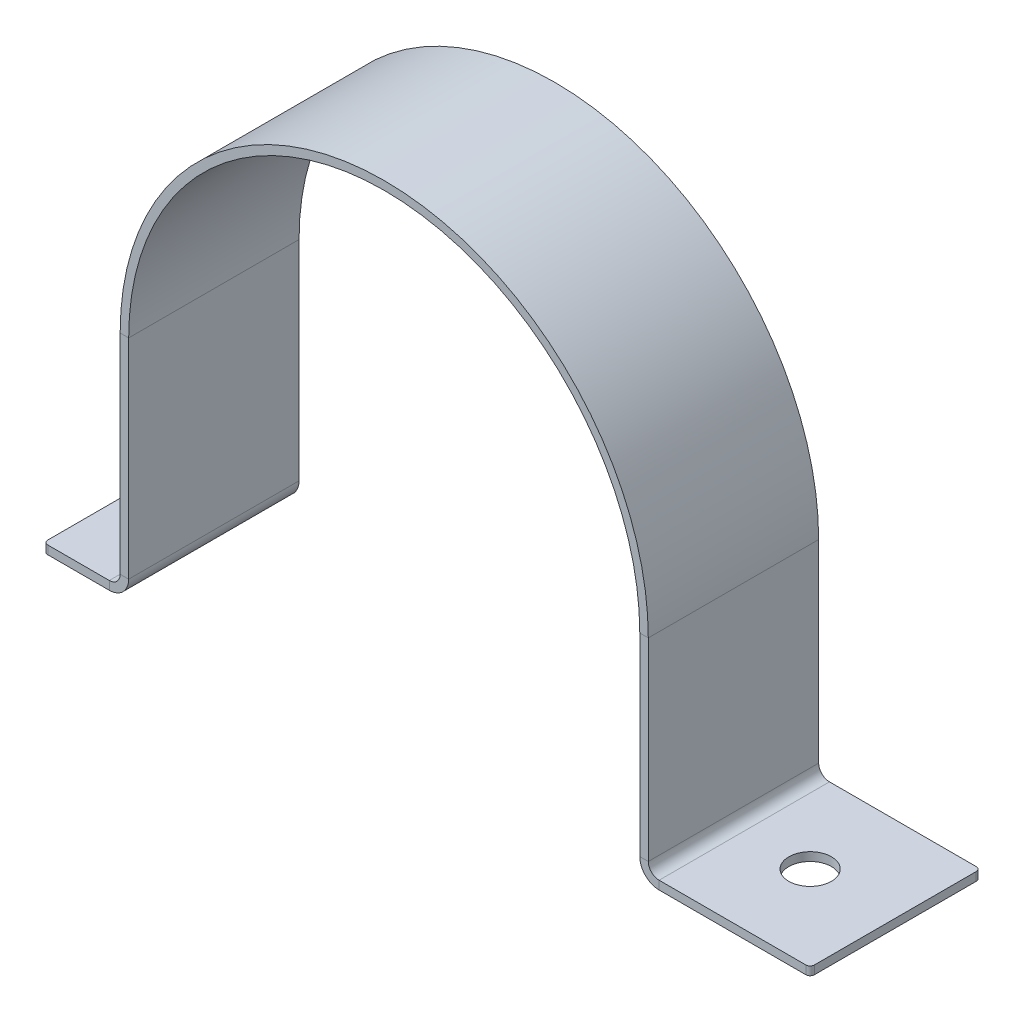
ISO-10303-21;
HEADER;
FILE_DESCRIPTION(('STEP AP214'),'2;1');
FILE_NAME('part.step','',(''),(''),'','','');
FILE_SCHEMA(('AUTOMOTIVE_DESIGN { 1 0 10303 214 1 1 1 1 }'));
ENDSEC;
DATA;
#1=APPLICATION_CONTEXT('core data for automotive mechanical design processes');
#2=APPLICATION_PROTOCOL_DEFINITION('international standard','automotive_design',2000,#1);
#3=PRODUCT_CONTEXT('',#1,'mechanical');
#4=PRODUCT('Part','Part','',(#3));
#5=PRODUCT_RELATED_PRODUCT_CATEGORY('part','',(#4));
#6=PRODUCT_DEFINITION_FORMATION('','',#4);
#7=PRODUCT_DEFINITION_CONTEXT('part definition',#1,'design');
#8=PRODUCT_DEFINITION('design','',#6,#7);
#9=PRODUCT_DEFINITION_SHAPE('','',#8);
#10=(LENGTH_UNIT() NAMED_UNIT(*) SI_UNIT(.MILLI.,.METRE.));
#11=(NAMED_UNIT(*) PLANE_ANGLE_UNIT() SI_UNIT($,.RADIAN.));
#12=(NAMED_UNIT(*) SI_UNIT($,.STERADIAN.) SOLID_ANGLE_UNIT());
#13=UNCERTAINTY_MEASURE_WITH_UNIT(LENGTH_MEASURE(1.E-05),#10,'distance_accuracy_value','');
#14=(GEOMETRIC_REPRESENTATION_CONTEXT(3) GLOBAL_UNCERTAINTY_ASSIGNED_CONTEXT((#13)) GLOBAL_UNIT_ASSIGNED_CONTEXT((#10,
#11,#12)) REPRESENTATION_CONTEXT('',''));
#15=CARTESIAN_POINT('',(0.,0.,0.));
#16=DIRECTION('',(0.,0.,1.));
#17=DIRECTION('',(1.,0.,0.));
#18=AXIS2_PLACEMENT_3D('',#15,#16,#17);
#19=CARTESIAN_POINT('',(-30.,0.,20.));
#20=DIRECTION('',(0.,0.,1.));
#21=DIRECTION('',(1.,0.,0.));
#22=AXIS2_PLACEMENT_3D('',#19,#20,#21);
#23=PLANE('',#22);
#24=DIRECTION('',(-1.,0.,0.));
#25=VECTOR('',#24,1.);
#26=CARTESIAN_POINT('',(-30.,0.,20.));
#27=LINE('',#26,#25);
#28=CARTESIAN_POINT('',(-30.,0.,20.));
#29=VERTEX_POINT('',#28);
#30=CARTESIAN_POINT('',(-31.,0.,20.));
#31=VERTEX_POINT('',#30);
#32=EDGE_CURVE('E343',#29,#31,#27,.T.);
#33=ORIENTED_EDGE('',*,*,#32,.F.);
#34=CARTESIAN_POINT('',(0.,0.,20.));
#35=DIRECTION('',(0.,0.,1.));
#36=DIRECTION('',(1.,0.,0.));
#37=AXIS2_PLACEMENT_3D('',#34,#35,#36);
#38=CIRCLE('',#37,30.);
#39=CARTESIAN_POINT('',(30.,0.,20.));
#40=VERTEX_POINT('',#39);
#41=EDGE_CURVE('E216',#40,#29,#38,.T.);
#42=ORIENTED_EDGE('',*,*,#41,.F.);
#43=DIRECTION('',(-1.,0.,0.));
#44=VECTOR('',#43,1.);
#45=CARTESIAN_POINT('',(31.,0.,20.));
#46=LINE('',#45,#44);
#47=CARTESIAN_POINT('',(31.,0.,20.));
#48=VERTEX_POINT('',#47);
#49=EDGE_CURVE('E341',#48,#40,#46,.T.);
#50=ORIENTED_EDGE('',*,*,#49,.F.);
#51=CARTESIAN_POINT('',(0.,0.,20.));
#52=DIRECTION('',(0.,0.,1.));
#53=DIRECTION('',(1.,0.,0.));
#54=AXIS2_PLACEMENT_3D('',#51,#52,#53);
#55=CIRCLE('',#54,31.);
#56=EDGE_CURVE('E238',#48,#31,#55,.T.);
#57=ORIENTED_EDGE('',*,*,#56,.T.);
#58=EDGE_LOOP('',(#33,#42,#50,#57));
#59=FACE_BOUND('',#58,.T.);
#60=ADVANCED_FACE('F37',(#59),#23,.T.);
#61=CARTESIAN_POINT('',(31.,0.,20.));
#62=DIRECTION('',(0.,0.,1.));
#63=DIRECTION('',(1.,0.,0.));
#64=AXIS2_PLACEMENT_3D('',#61,#62,#63);
#65=PLANE('',#64);
#66=DIRECTION('',(0.,-1.,0.));
#67=VECTOR('',#66,1.);
#68=CARTESIAN_POINT('',(-30.,0.,20.));
#69=LINE('',#68,#67);
#70=CARTESIAN_POINT('',(-30.,-24.53,20.));
#71=VERTEX_POINT('',#70);
#72=EDGE_CURVE('E214',#29,#71,#69,.T.);
#73=ORIENTED_EDGE('',*,*,#72,.F.);
#74=ORIENTED_EDGE('',*,*,#32,.T.);
#75=DIRECTION('',(0.,1.,0.));
#76=VECTOR('',#75,1.);
#77=CARTESIAN_POINT('',(-31.,0.,20.));
#78=LINE('',#77,#76);
#79=CARTESIAN_POINT('',(-31.,-24.53,20.));
#80=VERTEX_POINT('',#79);
#81=EDGE_CURVE('E241',#31,#80,#78,.F.);
#82=ORIENTED_EDGE('',*,*,#81,.T.);
#83=DIRECTION('',(1.,0.,0.));
#84=VECTOR('',#83,1.);
#85=CARTESIAN_POINT('',(-31.,-24.53,20.));
#86=LINE('',#85,#84);
#87=EDGE_CURVE('E188',#80,#71,#86,.T.);
#88=ORIENTED_EDGE('',*,*,#87,.T.);
#89=EDGE_LOOP('',(#73,#74,#82,#88));
#90=FACE_BOUND('',#89,.T.);
#91=ADVANCED_FACE('F427',(#90),#65,.T.);
#92=CARTESIAN_POINT('',(30.,0.,0.));
#93=DIRECTION('',(0.,0.,-1.));
#94=DIRECTION('',(-1.,0.,0.));
#95=AXIS2_PLACEMENT_3D('',#92,#93,#94);
#96=PLANE('',#95);
#97=DIRECTION('',(1.,0.,0.));
#98=VECTOR('',#97,1.);
#99=CARTESIAN_POINT('',(30.,0.,0.));
#100=LINE('',#99,#98);
#101=CARTESIAN_POINT('',(30.,0.,0.));
#102=VERTEX_POINT('',#101);
#103=CARTESIAN_POINT('',(31.,0.,0.));
#104=VERTEX_POINT('',#103);
#105=EDGE_CURVE('E339',#102,#104,#100,.T.);
#106=ORIENTED_EDGE('',*,*,#105,.F.);
#107=CARTESIAN_POINT('',(0.,0.,0.));
#108=DIRECTION('',(0.,0.,1.));
#109=DIRECTION('',(1.,0.,0.));
#110=AXIS2_PLACEMENT_3D('',#107,#108,#109);
#111=CIRCLE('',#110,30.);
#112=CARTESIAN_POINT('',(-30.,0.,0.));
#113=VERTEX_POINT('',#112);
#114=EDGE_CURVE('E256',#102,#113,#111,.T.);
#115=ORIENTED_EDGE('',*,*,#114,.T.);
#116=DIRECTION('',(1.,0.,0.));
#117=VECTOR('',#116,1.);
#118=CARTESIAN_POINT('',(-31.,0.,0.));
#119=LINE('',#118,#117);
#120=CARTESIAN_POINT('',(-31.,0.,0.));
#121=VERTEX_POINT('',#120);
#122=EDGE_CURVE('E337',#121,#113,#119,.T.);
#123=ORIENTED_EDGE('',*,*,#122,.F.);
#124=CARTESIAN_POINT('',(0.,0.,0.));
#125=DIRECTION('',(0.,0.,1.));
#126=DIRECTION('',(1.,0.,0.));
#127=AXIS2_PLACEMENT_3D('',#124,#125,#126);
#128=CIRCLE('',#127,31.);
#129=EDGE_CURVE('E275',#104,#121,#128,.T.);
#130=ORIENTED_EDGE('',*,*,#129,.F.);
#131=EDGE_LOOP('',(#106,#115,#123,#130));
#132=FACE_BOUND('',#131,.T.);
#133=ADVANCED_FACE('F466',(#132),#96,.T.);
#134=CARTESIAN_POINT('',(-31.,0.,0.));
#135=DIRECTION('',(0.,0.,-1.));
#136=DIRECTION('',(-1.,0.,0.));
#137=AXIS2_PLACEMENT_3D('',#134,#135,#136);
#138=PLANE('',#137);
#139=DIRECTION('',(0.,1.,0.));
#140=VECTOR('',#139,1.);
#141=CARTESIAN_POINT('',(30.,0.,0.));
#142=LINE('',#141,#140);
#143=CARTESIAN_POINT('',(30.,-22.73,0.));
#144=VERTEX_POINT('',#143);
#145=EDGE_CURVE('E259',#144,#102,#142,.T.);
#146=ORIENTED_EDGE('',*,*,#145,.T.);
#147=ORIENTED_EDGE('',*,*,#105,.T.);
#148=DIRECTION('',(0.,1.,0.));
#149=VECTOR('',#148,1.);
#150=CARTESIAN_POINT('',(31.,0.,0.));
#151=LINE('',#150,#149);
#152=CARTESIAN_POINT('',(31.,-22.73,0.));
#153=VERTEX_POINT('',#152);
#154=EDGE_CURVE('E272',#153,#104,#151,.T.);
#155=ORIENTED_EDGE('',*,*,#154,.F.);
#156=DIRECTION('',(-1.,0.,0.));
#157=VECTOR('',#156,1.);
#158=CARTESIAN_POINT('',(31.,-22.73,0.));
#159=LINE('',#158,#157);
#160=EDGE_CURVE('E187',#153,#144,#159,.T.);
#161=ORIENTED_EDGE('',*,*,#160,.T.);
#162=EDGE_LOOP('',(#146,#147,#155,#161));
#163=FACE_BOUND('',#162,.T.);
#164=ADVANCED_FACE('F749',(#163),#138,.T.);
#165=CARTESIAN_POINT('',(30.,-22.73,20.));
#166=DIRECTION('',(0.,0.,1.));
#167=DIRECTION('',(1.,0.,0.));
#168=AXIS2_PLACEMENT_3D('',#165,#166,#167);
#169=PLANE('',#168);
#170=DIRECTION('',(1.,0.,0.));
#171=VECTOR('',#170,1.);
#172=CARTESIAN_POINT('',(30.,-22.73,20.));
#173=LINE('',#172,#171);
#174=CARTESIAN_POINT('',(30.,-22.73,20.));
#175=VERTEX_POINT('',#174);
#176=CARTESIAN_POINT('',(31.,-22.73,20.));
#177=VERTEX_POINT('',#176);
#178=EDGE_CURVE('E335',#175,#177,#173,.T.);
#179=ORIENTED_EDGE('',*,*,#178,.F.);
#180=CARTESIAN_POINT('',(32.27,-22.73,20.));
#181=DIRECTION('',(0.,0.,1.));
#182=DIRECTION('',(1.,0.,0.));
#183=AXIS2_PLACEMENT_3D('',#180,#181,#182);
#184=CIRCLE('',#183,2.27);
#185=CARTESIAN_POINT('',(32.27,-25.,20.));
#186=VERTEX_POINT('',#185);
#187=EDGE_CURVE('E225',#186,#175,#184,.F.);
#188=ORIENTED_EDGE('',*,*,#187,.F.);
#189=DIRECTION('',(0.,-1.,0.));
#190=VECTOR('',#189,1.);
#191=CARTESIAN_POINT('',(32.27,-24.,20.));
#192=LINE('',#191,#190);
#193=CARTESIAN_POINT('',(32.27,-24.,20.));
#194=VERTEX_POINT('',#193);
#195=EDGE_CURVE('E332',#194,#186,#192,.T.);
#196=ORIENTED_EDGE('',*,*,#195,.F.);
#197=CARTESIAN_POINT('',(32.27,-22.73,20.));
#198=DIRECTION('',(0.,0.,1.));
#199=DIRECTION('',(1.,0.,0.));
#200=AXIS2_PLACEMENT_3D('',#197,#198,#199);
#201=CIRCLE('',#200,1.27);
#202=EDGE_CURVE('E232',#194,#177,#201,.F.);
#203=ORIENTED_EDGE('',*,*,#202,.T.);
#204=EDGE_LOOP('',(#179,#188,#196,#203));
#205=FACE_BOUND('',#204,.T.);
#206=ADVANCED_FACE('F401',(#205),#169,.T.);
#207=CARTESIAN_POINT('',(32.27,-24.,20.));
#208=DIRECTION('',(0.,0.,1.));
#209=DIRECTION('',(1.,0.,0.));
#210=AXIS2_PLACEMENT_3D('',#207,#208,#209);
#211=PLANE('',#210);
#212=DIRECTION('',(0.,1.,0.));
#213=VECTOR('',#212,1.);
#214=CARTESIAN_POINT('',(30.,0.,20.));
#215=LINE('',#214,#213);
#216=EDGE_CURVE('E222',#175,#40,#215,.T.);
#217=ORIENTED_EDGE('',*,*,#216,.F.);
#218=ORIENTED_EDGE('',*,*,#178,.T.);
#219=DIRECTION('',(0.,1.,0.));
#220=VECTOR('',#219,1.);
#221=CARTESIAN_POINT('',(31.,0.,20.));
#222=LINE('',#221,#220);
#223=EDGE_CURVE('E235',#177,#48,#222,.T.);
#224=ORIENTED_EDGE('',*,*,#223,.T.);
#225=ORIENTED_EDGE('',*,*,#49,.T.);
#226=EDGE_LOOP('',(#217,#218,#224,#225));
#227=FACE_BOUND('',#226,.T.);
#228=ADVANCED_FACE('F410',(#227),#211,.T.);
#229=CARTESIAN_POINT('',(32.27,-25.,0.));
#230=DIRECTION('',(0.,0.,-1.));
#231=DIRECTION('',(-1.,0.,0.));
#232=AXIS2_PLACEMENT_3D('',#229,#230,#231);
#233=PLANE('',#232);
#234=DIRECTION('',(0.,1.,0.));
#235=VECTOR('',#234,1.);
#236=CARTESIAN_POINT('',(32.27,-25.,0.));
#237=LINE('',#236,#235);
#238=CARTESIAN_POINT('',(32.27,-25.,0.));
#239=VERTEX_POINT('',#238);
#240=CARTESIAN_POINT('',(32.27,-24.,0.));
#241=VERTEX_POINT('',#240);
#242=EDGE_CURVE('E329',#239,#241,#237,.T.);
#243=ORIENTED_EDGE('',*,*,#242,.F.);
#244=CARTESIAN_POINT('',(32.27,-22.73,0.));
#245=DIRECTION('',(0.,0.,1.));
#246=DIRECTION('',(1.,0.,0.));
#247=AXIS2_PLACEMENT_3D('',#244,#245,#246);
#248=CIRCLE('',#247,2.27);
#249=EDGE_CURVE('E262',#239,#144,#248,.F.);
#250=ORIENTED_EDGE('',*,*,#249,.T.);
#251=ORIENTED_EDGE('',*,*,#160,.F.);
#252=CARTESIAN_POINT('',(32.27,-22.73,0.));
#253=DIRECTION('',(0.,0.,1.));
#254=DIRECTION('',(1.,0.,0.));
#255=AXIS2_PLACEMENT_3D('',#252,#253,#254);
#256=CIRCLE('',#255,1.27);
#257=EDGE_CURVE('E269',#241,#153,#256,.F.);
#258=ORIENTED_EDGE('',*,*,#257,.F.);
#259=EDGE_LOOP('',(#243,#250,#251,#258));
#260=FACE_BOUND('',#259,.T.);
#261=ADVANCED_FACE('F605',(#260),#233,.T.);
#262=CARTESIAN_POINT('',(31.,-22.73,0.));
#263=DIRECTION('',(0.,0.,-1.));
#264=DIRECTION('',(-1.,0.,0.));
#265=AXIS2_PLACEMENT_3D('',#262,#263,#264);
#266=PLANE('',#265);
#267=DIRECTION('',(-1.,0.,0.));
#268=VECTOR('',#267,1.);
#269=CARTESIAN_POINT('',(30.,-24.,0.));
#270=LINE('',#269,#268);
#271=CARTESIAN_POINT('',(49.5,-24.,0.));
#272=VERTEX_POINT('',#271);
#273=EDGE_CURVE('E267',#272,#241,#270,.T.);
#274=ORIENTED_EDGE('',*,*,#273,.F.);
#275=DIRECTION('',(0.,-1.,0.));
#276=VECTOR('',#275,1.);
#277=CARTESIAN_POINT('',(49.5,-22.73,0.));
#278=LINE('',#277,#276);
#279=CARTESIAN_POINT('',(49.5,-25.,0.));
#280=VERTEX_POINT('',#279);
#281=EDGE_CURVE('E362',#272,#280,#278,.T.);
#282=ORIENTED_EDGE('',*,*,#281,.T.);
#283=DIRECTION('',(-1.,0.,0.));
#284=VECTOR('',#283,1.);
#285=CARTESIAN_POINT('',(30.,-25.,0.));
#286=LINE('',#285,#284);
#287=EDGE_CURVE('E265',#280,#239,#286,.T.);
#288=ORIENTED_EDGE('',*,*,#287,.T.);
#289=ORIENTED_EDGE('',*,*,#242,.T.);
#290=EDGE_LOOP('',(#274,#282,#288,#289));
#291=FACE_BOUND('',#290,.T.);
#292=ADVANCED_FACE('F382',(#291),#266,.T.);
#293=CARTESIAN_POINT('',(-32.27,-26.8,20.));
#294=DIRECTION('',(0.,0.,1.));
#295=DIRECTION('',(1.,0.,0.));
#296=AXIS2_PLACEMENT_3D('',#293,#294,#295);
#297=PLANE('',#296);
#298=DIRECTION('',(0.,1.,0.));
#299=VECTOR('',#298,1.);
#300=CARTESIAN_POINT('',(-32.27,-26.8,20.));
#301=LINE('',#300,#299);
#302=CARTESIAN_POINT('',(-32.27,-26.8,20.));
#303=VERTEX_POINT('',#302);
#304=CARTESIAN_POINT('',(-32.27,-25.8,20.));
#305=VERTEX_POINT('',#304);
#306=EDGE_CURVE('E175',#303,#305,#301,.T.);
#307=ORIENTED_EDGE('',*,*,#306,.F.);
#308=CARTESIAN_POINT('',(-32.27,-24.53,20.));
#309=DIRECTION('',(0.,0.,1.));
#310=DIRECTION('',(1.,0.,0.));
#311=AXIS2_PLACEMENT_3D('',#308,#309,#310);
#312=CIRCLE('',#311,2.27);
#313=EDGE_CURVE('E179',#71,#303,#312,.F.);
#314=ORIENTED_EDGE('',*,*,#313,.F.);
#315=ORIENTED_EDGE('',*,*,#87,.F.);
#316=CARTESIAN_POINT('',(-32.27,-24.53,20.));
#317=DIRECTION('',(0.,0.,1.));
#318=DIRECTION('',(1.,0.,0.));
#319=AXIS2_PLACEMENT_3D('',#316,#317,#318);
#320=CIRCLE('',#319,1.27);
#321=EDGE_CURVE('E182',#80,#305,#320,.F.);
#322=ORIENTED_EDGE('',*,*,#321,.T.);
#323=EDGE_LOOP('',(#307,#314,#315,#322));
#324=FACE_BOUND('',#323,.T.);
#325=ADVANCED_FACE('F177',(#324),#297,.T.);
#326=CARTESIAN_POINT('',(-31.,-24.53,20.));
#327=DIRECTION('',(0.,0.,1.));
#328=DIRECTION('',(1.,0.,0.));
#329=AXIS2_PLACEMENT_3D('',#326,#327,#328);
#330=PLANE('',#329);
#331=DIRECTION('',(1.,0.,0.));
#332=VECTOR('',#331,1.);
#333=CARTESIAN_POINT('',(-30.,-25.8,20.));
#334=LINE('',#333,#332);
#335=CARTESIAN_POINT('',(-39.5,-25.8,20.));
#336=VERTEX_POINT('',#335);
#337=EDGE_CURVE('E209',#305,#336,#334,.F.);
#338=ORIENTED_EDGE('',*,*,#337,.T.);
#339=DIRECTION('',(0.,1.,0.));
#340=VECTOR('',#339,1.);
#341=CARTESIAN_POINT('',(-39.5,-24.53,20.));
#342=LINE('',#341,#340);
#343=CARTESIAN_POINT('',(-39.5,-26.8,20.));
#344=VERTEX_POINT('',#343);
#345=EDGE_CURVE('E208',#336,#344,#342,.F.);
#346=ORIENTED_EDGE('',*,*,#345,.T.);
#347=DIRECTION('',(-1.,0.,0.));
#348=VECTOR('',#347,1.);
#349=CARTESIAN_POINT('',(-30.,-26.8,20.));
#350=LINE('',#349,#348);
#351=EDGE_CURVE('E196',#303,#344,#350,.T.);
#352=ORIENTED_EDGE('',*,*,#351,.F.);
#353=ORIENTED_EDGE('',*,*,#306,.T.);
#354=EDGE_LOOP('',(#338,#346,#352,#353));
#355=FACE_BOUND('',#354,.T.);
#356=ADVANCED_FACE('F206',(#355),#330,.T.);
#357=CARTESIAN_POINT('',(-30.,-24.53,0.));
#358=DIRECTION('',(0.,0.,-1.));
#359=DIRECTION('',(-1.,0.,0.));
#360=AXIS2_PLACEMENT_3D('',#357,#358,#359);
#361=PLANE('',#360);
#362=DIRECTION('',(-1.,0.,0.));
#363=VECTOR('',#362,1.);
#364=CARTESIAN_POINT('',(-30.,-24.53,0.));
#365=LINE('',#364,#363);
#366=CARTESIAN_POINT('',(-30.,-24.53,0.));
#367=VERTEX_POINT('',#366);
#368=CARTESIAN_POINT('',(-31.,-24.53,0.));
#369=VERTEX_POINT('',#368);
#370=EDGE_CURVE('E325',#367,#369,#365,.T.);
#371=ORIENTED_EDGE('',*,*,#370,.F.);
#372=CARTESIAN_POINT('',(-32.27,-24.53,0.));
#373=DIRECTION('',(0.,0.,1.));
#374=DIRECTION('',(1.,0.,0.));
#375=AXIS2_PLACEMENT_3D('',#372,#373,#374);
#376=CIRCLE('',#375,2.27);
#377=CARTESIAN_POINT('',(-32.27,-26.8,0.));
#378=VERTEX_POINT('',#377);
#379=EDGE_CURVE('E251',#367,#378,#376,.F.);
#380=ORIENTED_EDGE('',*,*,#379,.T.);
#381=DIRECTION('',(0.,-1.,0.));
#382=VECTOR('',#381,1.);
#383=CARTESIAN_POINT('',(-32.27,-25.8,0.));
#384=LINE('',#383,#382);
#385=CARTESIAN_POINT('',(-32.27,-25.8,0.));
#386=VERTEX_POINT('',#385);
#387=EDGE_CURVE('E323',#386,#378,#384,.T.);
#388=ORIENTED_EDGE('',*,*,#387,.F.);
#389=CARTESIAN_POINT('',(-32.27,-24.53,0.));
#390=DIRECTION('',(0.,0.,1.));
#391=DIRECTION('',(1.,0.,0.));
#392=AXIS2_PLACEMENT_3D('',#389,#390,#391);
#393=CIRCLE('',#392,1.27);
#394=EDGE_CURVE('E281',#369,#386,#393,.F.);
#395=ORIENTED_EDGE('',*,*,#394,.F.);
#396=EDGE_LOOP('',(#371,#380,#388,#395));
#397=FACE_BOUND('',#396,.T.);
#398=ADVANCED_FACE('F591',(#397),#361,.T.);
#399=CARTESIAN_POINT('',(-32.27,-25.8,0.));
#400=DIRECTION('',(0.,0.,-1.));
#401=DIRECTION('',(-1.,0.,0.));
#402=AXIS2_PLACEMENT_3D('',#399,#400,#401);
#403=PLANE('',#402);
#404=DIRECTION('',(0.,-1.,0.));
#405=VECTOR('',#404,1.);
#406=CARTESIAN_POINT('',(-30.,0.,0.));
#407=LINE('',#406,#405);
#408=EDGE_CURVE('E253',#113,#367,#407,.T.);
#409=ORIENTED_EDGE('',*,*,#408,.T.);
#410=ORIENTED_EDGE('',*,*,#370,.T.);
#411=DIRECTION('',(0.,1.,0.));
#412=VECTOR('',#411,1.);
#413=CARTESIAN_POINT('',(-31.,0.,0.));
#414=LINE('',#413,#412);
#415=EDGE_CURVE('E278',#121,#369,#414,.F.);
#416=ORIENTED_EDGE('',*,*,#415,.F.);
#417=ORIENTED_EDGE('',*,*,#122,.T.);
#418=EDGE_LOOP('',(#409,#410,#416,#417));
#419=FACE_BOUND('',#418,.T.);
#420=ADVANCED_FACE('F579',(#419),#403,.T.);
#421=CARTESIAN_POINT('',(-30.,-25.8,20.));
#422=DIRECTION('',(0.,-1.,0.));
#423=DIRECTION('',(0.,0.,-1.));
#424=AXIS2_PLACEMENT_3D('',#421,#422,#423);
#425=PLANE('',#424);
#426=DIRECTION('',(0.,0.,-1.));
#427=VECTOR('',#426,1.);
#428=CARTESIAN_POINT('',(-40.,-25.8,20.));
#429=LINE('',#428,#427);
#430=CARTESIAN_POINT('',(-40.,-25.8,19.5));
#431=VERTEX_POINT('',#430);
#432=CARTESIAN_POINT('',(-40.,-25.8,0.5));
#433=VERTEX_POINT('',#432);
#434=EDGE_CURVE('E320',#431,#433,#429,.T.);
#435=ORIENTED_EDGE('',*,*,#434,.F.);
#436=CARTESIAN_POINT('',(-39.5,-25.8,19.5));
#437=DIRECTION('',(0.,-1.,0.));
#438=DIRECTION('',(0.,0.,-1.));
#439=AXIS2_PLACEMENT_3D('',#436,#437,#438);
#440=CIRCLE('',#439,0.5);
#441=EDGE_CURVE('E352',#431,#336,#440,.F.);
#442=ORIENTED_EDGE('',*,*,#441,.T.);
#443=ORIENTED_EDGE('',*,*,#337,.F.);
#444=DIRECTION('',(0.,0.,-1.));
#445=VECTOR('',#444,1.);
#446=CARTESIAN_POINT('',(-32.27,-25.8,20.));
#447=LINE('',#446,#445);
#448=EDGE_CURVE('E245',#305,#386,#447,.T.);
#449=ORIENTED_EDGE('',*,*,#448,.T.);
#450=DIRECTION('',(1.,0.,0.));
#451=VECTOR('',#450,1.);
#452=CARTESIAN_POINT('',(-30.,-25.8,0.));
#453=LINE('',#452,#451);
#454=CARTESIAN_POINT('',(-39.5,-25.8,0.));
#455=VERTEX_POINT('',#454);
#456=EDGE_CURVE('E246',#386,#455,#453,.F.);
#457=ORIENTED_EDGE('',*,*,#456,.T.);
#458=CARTESIAN_POINT('',(-39.5,-25.8,0.5));
#459=DIRECTION('',(0.,-1.,0.));
#460=DIRECTION('',(0.,0.,-1.));
#461=AXIS2_PLACEMENT_3D('',#458,#459,#460);
#462=CIRCLE('',#461,0.5);
#463=EDGE_CURVE('E350',#455,#433,#462,.F.);
#464=ORIENTED_EDGE('',*,*,#463,.T.);
#465=EDGE_LOOP('',(#435,#442,#443,#449,#457,#464));
#466=FACE_BOUND('',#465,.T.);
#467=ADVANCED_FACE('F440',(#466),#425,.F.);
#468=CARTESIAN_POINT('',(-40.,-26.8,20.));
#469=DIRECTION('',(-1.,0.,0.));
#470=DIRECTION('',(0.,0.,1.));
#471=AXIS2_PLACEMENT_3D('',#468,#469,#470);
#472=PLANE('',#471);
#473=DIRECTION('',(0.,0.,-1.));
#474=VECTOR('',#473,1.);
#475=CARTESIAN_POINT('',(-40.,-26.8,20.));
#476=LINE('',#475,#474);
#477=CARTESIAN_POINT('',(-40.,-26.8,19.5));
#478=VERTEX_POINT('',#477);
#479=CARTESIAN_POINT('',(-40.,-26.8,0.5));
#480=VERTEX_POINT('',#479);
#481=EDGE_CURVE('E203',#478,#480,#476,.T.);
#482=ORIENTED_EDGE('',*,*,#481,.F.);
#483=DIRECTION('',(0.,1.,0.));
#484=VECTOR('',#483,1.);
#485=CARTESIAN_POINT('',(-40.,-26.8,19.5));
#486=LINE('',#485,#484);
#487=EDGE_CURVE('E347',#478,#431,#486,.T.);
#488=ORIENTED_EDGE('',*,*,#487,.T.);
#489=ORIENTED_EDGE('',*,*,#434,.T.);
#490=DIRECTION('',(0.,1.,0.));
#491=VECTOR('',#490,1.);
#492=CARTESIAN_POINT('',(-40.,-26.8,0.5));
#493=LINE('',#492,#491);
#494=EDGE_CURVE('E345',#433,#480,#493,.F.);
#495=ORIENTED_EDGE('',*,*,#494,.T.);
#496=EDGE_LOOP('',(#482,#488,#489,#495));
#497=FACE_BOUND('',#496,.T.);
#498=ADVANCED_FACE('F557',(#497),#472,.T.);
#499=CARTESIAN_POINT('',(-30.,-26.8,20.));
#500=DIRECTION('',(0.,-1.,0.));
#501=DIRECTION('',(0.,0.,-1.));
#502=AXIS2_PLACEMENT_3D('',#499,#500,#501);
#503=PLANE('',#502);
#504=ORIENTED_EDGE('',*,*,#351,.T.);
#505=CARTESIAN_POINT('',(-39.5,-26.8,19.5));
#506=DIRECTION('',(0.,-1.,0.));
#507=DIRECTION('',(0.,0.,-1.));
#508=AXIS2_PLACEMENT_3D('',#505,#506,#507);
#509=CIRCLE('',#508,0.5);
#510=EDGE_CURVE('E357',#344,#478,#509,.T.);
#511=ORIENTED_EDGE('',*,*,#510,.T.);
#512=ORIENTED_EDGE('',*,*,#481,.T.);
#513=CARTESIAN_POINT('',(-39.5,-26.8,0.5));
#514=DIRECTION('',(0.,-1.,0.));
#515=DIRECTION('',(0.,0.,-1.));
#516=AXIS2_PLACEMENT_3D('',#513,#514,#515);
#517=CIRCLE('',#516,0.5);
#518=CARTESIAN_POINT('',(-39.5,-26.8,0.));
#519=VERTEX_POINT('',#518);
#520=EDGE_CURVE('E355',#480,#519,#517,.T.);
#521=ORIENTED_EDGE('',*,*,#520,.T.);
#522=DIRECTION('',(-1.,0.,0.));
#523=VECTOR('',#522,1.);
#524=CARTESIAN_POINT('',(-30.,-26.8,0.));
#525=LINE('',#524,#523);
#526=EDGE_CURVE('E199',#378,#519,#525,.T.);
#527=ORIENTED_EDGE('',*,*,#526,.F.);
#528=DIRECTION('',(0.,0.,-1.));
#529=VECTOR('',#528,1.);
#530=CARTESIAN_POINT('',(-32.27,-26.8,20.));
#531=LINE('',#530,#529);
#532=EDGE_CURVE('E194',#303,#378,#531,.T.);
#533=ORIENTED_EDGE('',*,*,#532,.F.);
#534=EDGE_LOOP('',(#504,#511,#512,#521,#527,#533));
#535=FACE_BOUND('',#534,.T.);
#536=ADVANCED_FACE('F195',(#535),#503,.T.);
#537=CARTESIAN_POINT('',(-32.27,-24.53,20.));
#538=DIRECTION('',(0.,0.,-1.));
#539=DIRECTION('',(-1.,0.,0.));
#540=AXIS2_PLACEMENT_3D('',#537,#538,#539);
#541=CYLINDRICAL_SURFACE('',#540,2.27);
#542=ORIENTED_EDGE('',*,*,#379,.F.);
#543=DIRECTION('',(0.,0.,-1.));
#544=VECTOR('',#543,1.);
#545=CARTESIAN_POINT('',(-30.,-24.53,20.));
#546=LINE('',#545,#544);
#547=EDGE_CURVE('E204',#71,#367,#546,.T.);
#548=ORIENTED_EDGE('',*,*,#547,.F.);
#549=ORIENTED_EDGE('',*,*,#313,.T.);
#550=ORIENTED_EDGE('',*,*,#532,.T.);
#551=EDGE_LOOP('',(#542,#548,#549,#550));
#552=FACE_BOUND('',#551,.T.);
#553=ADVANCED_FACE('F212',(#552),#541,.T.);
#554=CARTESIAN_POINT('',(-30.,0.,20.));
#555=DIRECTION('',(1.,0.,0.));
#556=DIRECTION('',(0.,0.,-1.));
#557=AXIS2_PLACEMENT_3D('',#554,#555,#556);
#558=PLANE('',#557);
#559=ORIENTED_EDGE('',*,*,#408,.F.);
#560=DIRECTION('',(0.,0.,-1.));
#561=VECTOR('',#560,1.);
#562=CARTESIAN_POINT('',(-30.,0.,20.));
#563=LINE('',#562,#561);
#564=EDGE_CURVE('E314',#29,#113,#563,.T.);
#565=ORIENTED_EDGE('',*,*,#564,.F.);
#566=ORIENTED_EDGE('',*,*,#72,.T.);
#567=ORIENTED_EDGE('',*,*,#547,.T.);
#568=EDGE_LOOP('',(#559,#565,#566,#567));
#569=FACE_BOUND('',#568,.T.);
#570=ADVANCED_FACE('F426',(#569),#558,.T.);
#571=CARTESIAN_POINT('',(0.,0.,20.));
#572=DIRECTION('',(0.,0.,-1.));
#573=DIRECTION('',(-1.,0.,0.));
#574=AXIS2_PLACEMENT_3D('',#571,#572,#573);
#575=CYLINDRICAL_SURFACE('',#574,30.);
#576=ORIENTED_EDGE('',*,*,#114,.F.);
#577=DIRECTION('',(0.,0.,-1.));
#578=VECTOR('',#577,1.);
#579=CARTESIAN_POINT('',(30.,0.,20.));
#580=LINE('',#579,#578);
#581=EDGE_CURVE('E311',#40,#102,#580,.T.);
#582=ORIENTED_EDGE('',*,*,#581,.F.);
#583=ORIENTED_EDGE('',*,*,#41,.T.);
#584=ORIENTED_EDGE('',*,*,#564,.T.);
#585=EDGE_LOOP('',(#576,#582,#583,#584));
#586=FACE_BOUND('',#585,.T.);
#587=ADVANCED_FACE('F418',(#586),#575,.F.);
#588=CARTESIAN_POINT('',(30.,0.,20.));
#589=DIRECTION('',(-1.,0.,0.));
#590=DIRECTION('',(0.,-1.,0.));
#591=AXIS2_PLACEMENT_3D('',#588,#589,#590);
#592=PLANE('',#591);
#593=ORIENTED_EDGE('',*,*,#145,.F.);
#594=DIRECTION('',(0.,0.,-1.));
#595=VECTOR('',#594,1.);
#596=CARTESIAN_POINT('',(30.,-22.73,20.));
#597=LINE('',#596,#595);
#598=EDGE_CURVE('E308',#175,#144,#597,.T.);
#599=ORIENTED_EDGE('',*,*,#598,.F.);
#600=ORIENTED_EDGE('',*,*,#216,.T.);
#601=ORIENTED_EDGE('',*,*,#581,.T.);
#602=EDGE_LOOP('',(#593,#599,#600,#601));
#603=FACE_BOUND('',#602,.T.);
#604=ADVANCED_FACE('F409',(#603),#592,.T.);
#605=CARTESIAN_POINT('',(32.27,-22.73,20.));
#606=DIRECTION('',(0.,0.,-1.));
#607=DIRECTION('',(-1.,0.,0.));
#608=AXIS2_PLACEMENT_3D('',#605,#606,#607);
#609=CYLINDRICAL_SURFACE('',#608,2.27);
#610=ORIENTED_EDGE('',*,*,#249,.F.);
#611=DIRECTION('',(0.,0.,-1.));
#612=VECTOR('',#611,1.);
#613=CARTESIAN_POINT('',(32.27,-25.,20.));
#614=LINE('',#613,#612);
#615=EDGE_CURVE('E305',#186,#239,#614,.T.);
#616=ORIENTED_EDGE('',*,*,#615,.F.);
#617=ORIENTED_EDGE('',*,*,#187,.T.);
#618=ORIENTED_EDGE('',*,*,#598,.T.);
#619=EDGE_LOOP('',(#610,#616,#617,#618));
#620=FACE_BOUND('',#619,.T.);
#621=ADVANCED_FACE('F400',(#620),#609,.T.);
#622=CARTESIAN_POINT('',(30.,-25.,20.));
#623=DIRECTION('',(0.,-1.,0.));
#624=DIRECTION('',(1.,0.,0.));
#625=AXIS2_PLACEMENT_3D('',#622,#623,#624);
#626=PLANE('',#625);
#627=CARTESIAN_POINT('',(40.,-25.,10.));
#628=DIRECTION('',(0.,-1.,0.));
#629=DIRECTION('',(1.,0.,0.));
#630=AXIS2_PLACEMENT_3D('',#627,#628,#629);
#631=CIRCLE('',#630,2.5);
#632=CARTESIAN_POINT('',(42.5,-25.,10.));
#633=VERTEX_POINT('',#632);
#634=EDGE_CURVE('E249',#633,#633,#631,.T.);
#635=ORIENTED_EDGE('',*,*,#634,.F.);
#636=EDGE_LOOP('',(#635));
#637=FACE_BOUND('',#636,.T.);
#638=ORIENTED_EDGE('',*,*,#287,.F.);
#639=CARTESIAN_POINT('',(49.5,-25.,0.5));
#640=DIRECTION('',(0.,-1.,0.));
#641=DIRECTION('',(1.,0.,0.));
#642=AXIS2_PLACEMENT_3D('',#639,#640,#641);
#643=CIRCLE('',#642,0.5);
#644=CARTESIAN_POINT('',(50.,-25.,0.5));
#645=VERTEX_POINT('',#644);
#646=EDGE_CURVE('E367',#280,#645,#643,.T.);
#647=ORIENTED_EDGE('',*,*,#646,.T.);
#648=DIRECTION('',(0.,0.,-1.));
#649=VECTOR('',#648,1.);
#650=CARTESIAN_POINT('',(50.,-25.,20.));
#651=LINE('',#650,#649);
#652=CARTESIAN_POINT('',(50.,-25.,19.5));
#653=VERTEX_POINT('',#652);
#654=EDGE_CURVE('E303',#653,#645,#651,.T.);
#655=ORIENTED_EDGE('',*,*,#654,.F.);
#656=CARTESIAN_POINT('',(49.5,-25.,19.5));
#657=DIRECTION('',(0.,-1.,0.));
#658=DIRECTION('',(1.,0.,0.));
#659=AXIS2_PLACEMENT_3D('',#656,#657,#658);
#660=CIRCLE('',#659,0.5);
#661=CARTESIAN_POINT('',(49.5,-25.,20.));
#662=VERTEX_POINT('',#661);
#663=EDGE_CURVE('E365',#653,#662,#660,.T.);
#664=ORIENTED_EDGE('',*,*,#663,.T.);
#665=DIRECTION('',(-1.,0.,0.));
#666=VECTOR('',#665,1.);
#667=CARTESIAN_POINT('',(30.,-25.,20.));
#668=LINE('',#667,#666);
#669=EDGE_CURVE('E228',#662,#186,#668,.T.);
#670=ORIENTED_EDGE('',*,*,#669,.T.);
#671=ORIENTED_EDGE('',*,*,#615,.T.);
#672=EDGE_LOOP('',(#638,#647,#655,#664,#670,#671));
#673=FACE_BOUND('',#672,.T.);
#674=ADVANCED_FACE('F388',(#637,#673),#626,.T.);
#675=CARTESIAN_POINT('',(50.,-24.,20.));
#676=DIRECTION('',(1.,0.,0.));
#677=DIRECTION('',(0.,0.,-1.));
#678=AXIS2_PLACEMENT_3D('',#675,#676,#677);
#679=PLANE('',#678);
#680=ORIENTED_EDGE('',*,*,#654,.T.);
#681=DIRECTION('',(0.,-1.,0.));
#682=VECTOR('',#681,1.);
#683=CARTESIAN_POINT('',(50.,-24.,0.5));
#684=LINE('',#683,#682);
#685=CARTESIAN_POINT('',(50.,-24.,0.5));
#686=VERTEX_POINT('',#685);
#687=EDGE_CURVE('E58',#645,#686,#684,.F.);
#688=ORIENTED_EDGE('',*,*,#687,.T.);
#689=DIRECTION('',(0.,0.,-1.));
#690=VECTOR('',#689,1.);
#691=CARTESIAN_POINT('',(50.,-24.,20.));
#692=LINE('',#691,#690);
#693=CARTESIAN_POINT('',(50.,-24.,19.5));
#694=VERTEX_POINT('',#693);
#695=EDGE_CURVE('E301',#694,#686,#692,.T.);
#696=ORIENTED_EDGE('',*,*,#695,.F.);
#697=DIRECTION('',(0.,-1.,0.));
#698=VECTOR('',#697,1.);
#699=CARTESIAN_POINT('',(50.,-24.,19.5));
#700=LINE('',#699,#698);
#701=EDGE_CURVE('E369',#694,#653,#700,.T.);
#702=ORIENTED_EDGE('',*,*,#701,.T.);
#703=EDGE_LOOP('',(#680,#688,#696,#702));
#704=FACE_BOUND('',#703,.T.);
#705=ADVANCED_FACE('F389',(#704),#679,.T.);
#706=CARTESIAN_POINT('',(30.,-24.,20.));
#707=DIRECTION('',(0.,-1.,0.));
#708=DIRECTION('',(1.,0.,0.));
#709=AXIS2_PLACEMENT_3D('',#706,#707,#708);
#710=PLANE('',#709);
#711=CARTESIAN_POINT('',(40.,-24.,10.));
#712=DIRECTION('',(0.,1.,0.));
#713=DIRECTION('',(0.,0.,1.));
#714=AXIS2_PLACEMENT_3D('',#711,#712,#713);
#715=CIRCLE('',#714,2.5);
#716=CARTESIAN_POINT('',(40.,-24.,12.5));
#717=VERTEX_POINT('',#716);
#718=EDGE_CURVE('E444',#717,#717,#715,.T.);
#719=ORIENTED_EDGE('',*,*,#718,.F.);
#720=EDGE_LOOP('',(#719));
#721=FACE_BOUND('',#720,.T.);
#722=ORIENTED_EDGE('',*,*,#695,.T.);
#723=CARTESIAN_POINT('',(49.5,-24.,0.5));
#724=DIRECTION('',(0.,-1.,0.));
#725=DIRECTION('',(1.,0.,0.));
#726=AXIS2_PLACEMENT_3D('',#723,#724,#725);
#727=CIRCLE('',#726,0.5);
#728=EDGE_CURVE('E45',#686,#272,#727,.F.);
#729=ORIENTED_EDGE('',*,*,#728,.T.);
#730=ORIENTED_EDGE('',*,*,#273,.T.);
#731=DIRECTION('',(0.,0.,-1.));
#732=VECTOR('',#731,1.);
#733=CARTESIAN_POINT('',(32.27,-24.,20.));
#734=LINE('',#733,#732);
#735=EDGE_CURVE('E298',#194,#241,#734,.T.);
#736=ORIENTED_EDGE('',*,*,#735,.F.);
#737=DIRECTION('',(-1.,0.,0.));
#738=VECTOR('',#737,1.);
#739=CARTESIAN_POINT('',(30.,-24.,20.));
#740=LINE('',#739,#738);
#741=CARTESIAN_POINT('',(49.5,-24.,20.));
#742=VERTEX_POINT('',#741);
#743=EDGE_CURVE('E230',#742,#194,#740,.T.);
#744=ORIENTED_EDGE('',*,*,#743,.F.);
#745=CARTESIAN_POINT('',(49.5,-24.,19.5));
#746=DIRECTION('',(0.,-1.,0.));
#747=DIRECTION('',(1.,0.,0.));
#748=AXIS2_PLACEMENT_3D('',#745,#746,#747);
#749=CIRCLE('',#748,0.5);
#750=EDGE_CURVE('E373',#742,#694,#749,.F.);
#751=ORIENTED_EDGE('',*,*,#750,.T.);
#752=EDGE_LOOP('',(#722,#729,#730,#736,#744,#751));
#753=FACE_BOUND('',#752,.T.);
#754=ADVANCED_FACE('F377',(#721,#753),#710,.F.);
#755=CARTESIAN_POINT('',(32.27,-22.73,20.));
#756=DIRECTION('',(0.,0.,-1.));
#757=DIRECTION('',(-1.,0.,0.));
#758=AXIS2_PLACEMENT_3D('',#755,#756,#757);
#759=CYLINDRICAL_SURFACE('',#758,1.27);
#760=ORIENTED_EDGE('',*,*,#257,.T.);
#761=DIRECTION('',(0.,0.,-1.));
#762=VECTOR('',#761,1.);
#763=CARTESIAN_POINT('',(31.,-22.73,20.));
#764=LINE('',#763,#762);
#765=EDGE_CURVE('E295',#177,#153,#764,.T.);
#766=ORIENTED_EDGE('',*,*,#765,.F.);
#767=ORIENTED_EDGE('',*,*,#202,.F.);
#768=ORIENTED_EDGE('',*,*,#735,.T.);
#769=EDGE_LOOP('',(#760,#766,#767,#768));
#770=FACE_BOUND('',#769,.T.);
#771=ADVANCED_FACE('F451',(#770),#759,.F.);
#772=CARTESIAN_POINT('',(31.,0.,20.));
#773=DIRECTION('',(-1.,0.,0.));
#774=DIRECTION('',(0.,-1.,0.));
#775=AXIS2_PLACEMENT_3D('',#772,#773,#774);
#776=PLANE('',#775);
#777=ORIENTED_EDGE('',*,*,#154,.T.);
#778=DIRECTION('',(0.,0.,-1.));
#779=VECTOR('',#778,1.);
#780=CARTESIAN_POINT('',(31.,0.,20.));
#781=LINE('',#780,#779);
#782=EDGE_CURVE('E292',#48,#104,#781,.T.);
#783=ORIENTED_EDGE('',*,*,#782,.F.);
#784=ORIENTED_EDGE('',*,*,#223,.F.);
#785=ORIENTED_EDGE('',*,*,#765,.T.);
#786=EDGE_LOOP('',(#777,#783,#784,#785));
#787=FACE_BOUND('',#786,.T.);
#788=ADVANCED_FACE('F457',(#787),#776,.F.);
#789=CARTESIAN_POINT('',(0.,0.,20.));
#790=DIRECTION('',(0.,0.,-1.));
#791=DIRECTION('',(-1.,0.,0.));
#792=AXIS2_PLACEMENT_3D('',#789,#790,#791);
#793=CYLINDRICAL_SURFACE('',#792,31.);
#794=ORIENTED_EDGE('',*,*,#129,.T.);
#795=DIRECTION('',(0.,0.,-1.));
#796=VECTOR('',#795,1.);
#797=CARTESIAN_POINT('',(-31.,0.,20.));
#798=LINE('',#797,#796);
#799=EDGE_CURVE('E289',#31,#121,#798,.T.);
#800=ORIENTED_EDGE('',*,*,#799,.F.);
#801=ORIENTED_EDGE('',*,*,#56,.F.);
#802=ORIENTED_EDGE('',*,*,#782,.T.);
#803=EDGE_LOOP('',(#794,#800,#801,#802));
#804=FACE_BOUND('',#803,.T.);
#805=ADVANCED_FACE('F632',(#804),#793,.T.);
#806=CARTESIAN_POINT('',(-31.,0.,20.));
#807=DIRECTION('',(1.,0.,0.));
#808=DIRECTION('',(0.,0.,-1.));
#809=AXIS2_PLACEMENT_3D('',#806,#807,#808);
#810=PLANE('',#809);
#811=ORIENTED_EDGE('',*,*,#415,.T.);
#812=DIRECTION('',(0.,0.,-1.));
#813=VECTOR('',#812,1.);
#814=CARTESIAN_POINT('',(-31.,-24.53,20.));
#815=LINE('',#814,#813);
#816=EDGE_CURVE('E286',#80,#369,#815,.T.);
#817=ORIENTED_EDGE('',*,*,#816,.F.);
#818=ORIENTED_EDGE('',*,*,#81,.F.);
#819=ORIENTED_EDGE('',*,*,#799,.T.);
#820=EDGE_LOOP('',(#811,#817,#818,#819));
#821=FACE_BOUND('',#820,.T.);
#822=ADVANCED_FACE('F431',(#821),#810,.F.);
#823=CARTESIAN_POINT('',(-32.27,-24.53,20.));
#824=DIRECTION('',(0.,0.,-1.));
#825=DIRECTION('',(-1.,0.,0.));
#826=AXIS2_PLACEMENT_3D('',#823,#824,#825);
#827=CYLINDRICAL_SURFACE('',#826,1.27);
#828=ORIENTED_EDGE('',*,*,#394,.T.);
#829=ORIENTED_EDGE('',*,*,#448,.F.);
#830=ORIENTED_EDGE('',*,*,#321,.F.);
#831=ORIENTED_EDGE('',*,*,#816,.T.);
#832=EDGE_LOOP('',(#828,#829,#830,#831));
#833=FACE_BOUND('',#832,.T.);
#834=ADVANCED_FACE('F435',(#833),#827,.F.);
#835=CARTESIAN_POINT('',(-32.27,-24.53,20.));
#836=DIRECTION('',(0.,0.,1.));
#837=DIRECTION('',(1.,0.,0.));
#838=AXIS2_PLACEMENT_3D('',#835,#836,#837);
#839=PLANE('',#838);
#840=ORIENTED_EDGE('',*,*,#669,.F.);
#841=DIRECTION('',(0.,-1.,0.));
#842=VECTOR('',#841,1.);
#843=CARTESIAN_POINT('',(49.5,-24.53,20.));
#844=LINE('',#843,#842);
#845=EDGE_CURVE('E11',#662,#742,#844,.F.);
#846=ORIENTED_EDGE('',*,*,#845,.T.);
#847=ORIENTED_EDGE('',*,*,#743,.T.);
#848=ORIENTED_EDGE('',*,*,#195,.T.);
#849=EDGE_LOOP('',(#840,#846,#847,#848));
#850=FACE_BOUND('',#849,.T.);
#851=ADVANCED_FACE('F393',(#850),#839,.T.);
#852=CARTESIAN_POINT('',(-32.27,-24.53,0.));
#853=DIRECTION('',(0.,0.,1.));
#854=DIRECTION('',(1.,0.,0.));
#855=AXIS2_PLACEMENT_3D('',#852,#853,#854);
#856=PLANE('',#855);
#857=ORIENTED_EDGE('',*,*,#526,.T.);
#858=DIRECTION('',(0.,1.,0.));
#859=VECTOR('',#858,1.);
#860=CARTESIAN_POINT('',(-39.5,-25.8,0.));
#861=LINE('',#860,#859);
#862=EDGE_CURVE('E359',#519,#455,#861,.T.);
#863=ORIENTED_EDGE('',*,*,#862,.T.);
#864=ORIENTED_EDGE('',*,*,#456,.F.);
#865=ORIENTED_EDGE('',*,*,#387,.T.);
#866=EDGE_LOOP('',(#857,#863,#864,#865));
#867=FACE_BOUND('',#866,.T.);
#868=ADVANCED_FACE('F506',(#867),#856,.F.);
#869=CARTESIAN_POINT('',(40.,-34.,10.));
#870=DIRECTION('',(0.,1.,0.));
#871=DIRECTION('',(0.,0.,1.));
#872=AXIS2_PLACEMENT_3D('',#869,#870,#871);
#873=CYLINDRICAL_SURFACE('',#872,2.5);
#874=ORIENTED_EDGE('',*,*,#634,.T.);
#875=EDGE_LOOP('',(#874));
#876=FACE_BOUND('',#875,.T.);
#877=ORIENTED_EDGE('',*,*,#718,.T.);
#878=EDGE_LOOP('',(#877));
#879=FACE_BOUND('',#878,.T.);
#880=ADVANCED_FACE('F448',(#876,#879),#873,.F.);
#881=CARTESIAN_POINT('',(-39.5,-26.8,19.5));
#882=DIRECTION('',(0.,1.,0.));
#883=DIRECTION('',(0.,0.,1.));
#884=AXIS2_PLACEMENT_3D('',#881,#882,#883);
#885=CYLINDRICAL_SURFACE('',#884,0.5);
#886=ORIENTED_EDGE('',*,*,#510,.F.);
#887=ORIENTED_EDGE('',*,*,#345,.F.);
#888=ORIENTED_EDGE('',*,*,#441,.F.);
#889=ORIENTED_EDGE('',*,*,#487,.F.);
#890=EDGE_LOOP('',(#886,#887,#888,#889));
#891=FACE_BOUND('',#890,.T.);
#892=ADVANCED_FACE('F470',(#891),#885,.T.);
#893=CARTESIAN_POINT('',(-39.5,-24.53,0.5));
#894=DIRECTION('',(0.,-1.,0.));
#895=DIRECTION('',(0.,0.,-1.));
#896=AXIS2_PLACEMENT_3D('',#893,#894,#895);
#897=CYLINDRICAL_SURFACE('',#896,0.5);
#898=ORIENTED_EDGE('',*,*,#520,.F.);
#899=ORIENTED_EDGE('',*,*,#494,.F.);
#900=ORIENTED_EDGE('',*,*,#463,.F.);
#901=ORIENTED_EDGE('',*,*,#862,.F.);
#902=EDGE_LOOP('',(#898,#899,#900,#901));
#903=FACE_BOUND('',#902,.T.);
#904=ADVANCED_FACE('F473',(#903),#897,.T.);
#905=CARTESIAN_POINT('',(49.5,-22.73,0.5));
#906=DIRECTION('',(0.,-1.,0.));
#907=DIRECTION('',(0.,0.,-1.));
#908=AXIS2_PLACEMENT_3D('',#905,#906,#907);
#909=CYLINDRICAL_SURFACE('',#908,0.5);
#910=ORIENTED_EDGE('',*,*,#728,.F.);
#911=ORIENTED_EDGE('',*,*,#687,.F.);
#912=ORIENTED_EDGE('',*,*,#646,.F.);
#913=ORIENTED_EDGE('',*,*,#281,.F.);
#914=EDGE_LOOP('',(#910,#911,#912,#913));
#915=FACE_BOUND('',#914,.T.);
#916=ADVANCED_FACE('F385',(#915),#909,.T.);
#917=CARTESIAN_POINT('',(49.5,-24.,19.5));
#918=DIRECTION('',(0.,-1.,0.));
#919=DIRECTION('',(0.,0.,-1.));
#920=AXIS2_PLACEMENT_3D('',#917,#918,#919);
#921=CYLINDRICAL_SURFACE('',#920,0.5);
#922=ORIENTED_EDGE('',*,*,#750,.F.);
#923=ORIENTED_EDGE('',*,*,#845,.F.);
#924=ORIENTED_EDGE('',*,*,#663,.F.);
#925=ORIENTED_EDGE('',*,*,#701,.F.);
#926=EDGE_LOOP('',(#922,#923,#924,#925));
#927=FACE_BOUND('',#926,.T.);
#928=ADVANCED_FACE('F39',(#927),#921,.T.);
#929=CLOSED_SHELL('',(#60,#91,#133,#164,#206,#228,#261,#292,#325,#356,#398,#420,#467,#498,#536,
#553,#570,#587,#604,#621,#674,#705,#754,#771,#788,#805,#822,#834,#851,#868,#880,#892,#904,#916,#928));
#930=MANIFOLD_SOLID_BREP('B2',#929);
#931=ADVANCED_BREP_SHAPE_REPRESENTATION('',(#18,#930),#14);
#932=SHAPE_DEFINITION_REPRESENTATION(#9,#931);
ENDSEC;
END-ISO-10303-21;
